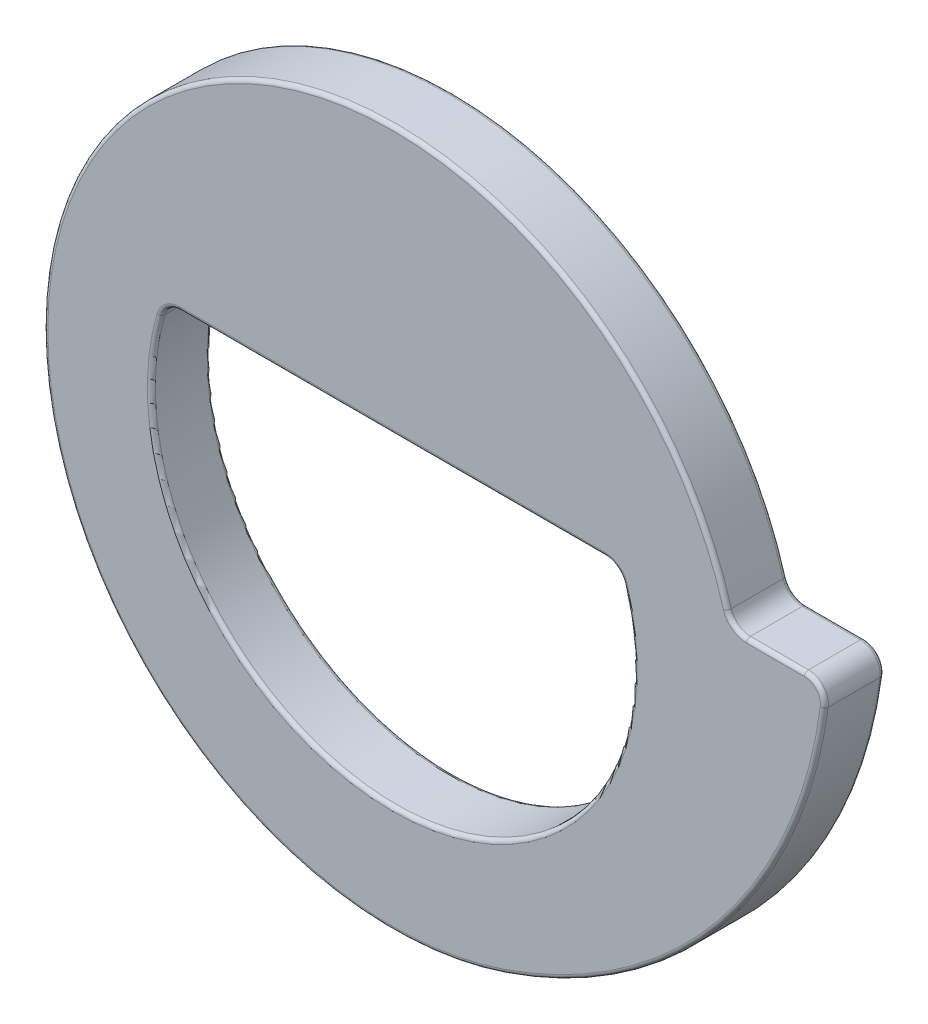
ISO-10303-21;
HEADER;
FILE_DESCRIPTION(('STEP AP214'),'2;1');
FILE_NAME('part.step','',(''),(''),'','','');
FILE_SCHEMA(('AUTOMOTIVE_DESIGN { 1 0 10303 214 1 1 1 1 }'));
ENDSEC;
DATA;
#1=APPLICATION_CONTEXT('core data for automotive mechanical design processes');
#2=APPLICATION_PROTOCOL_DEFINITION('international standard','automotive_design',2000,#1);
#3=PRODUCT_CONTEXT('',#1,'mechanical');
#4=PRODUCT('Part','Part','',(#3));
#5=PRODUCT_RELATED_PRODUCT_CATEGORY('part','',(#4));
#6=PRODUCT_DEFINITION_FORMATION('','',#4);
#7=PRODUCT_DEFINITION_CONTEXT('part definition',#1,'design');
#8=PRODUCT_DEFINITION('design','',#6,#7);
#9=PRODUCT_DEFINITION_SHAPE('','',#8);
#10=(LENGTH_UNIT() NAMED_UNIT(*) SI_UNIT(.MILLI.,.METRE.));
#11=(NAMED_UNIT(*) PLANE_ANGLE_UNIT() SI_UNIT($,.RADIAN.));
#12=(NAMED_UNIT(*) SI_UNIT($,.STERADIAN.) SOLID_ANGLE_UNIT());
#13=UNCERTAINTY_MEASURE_WITH_UNIT(LENGTH_MEASURE(1.E-05),#10,'distance_accuracy_value','');
#14=(GEOMETRIC_REPRESENTATION_CONTEXT(3) GLOBAL_UNCERTAINTY_ASSIGNED_CONTEXT((#13)) GLOBAL_UNIT_ASSIGNED_CONTEXT((#10,
#11,#12)) REPRESENTATION_CONTEXT('',''));
#15=CARTESIAN_POINT('',(0.,0.,0.));
#16=DIRECTION('',(0.,0.,1.));
#17=DIRECTION('',(1.,0.,0.));
#18=AXIS2_PLACEMENT_3D('',#15,#16,#17);
#19=CARTESIAN_POINT('',(8.891569040389,2.55,1.4));
#20=DIRECTION('',(0.,0.,1.));
#21=DIRECTION('',(1.,0.,0.));
#22=AXIS2_PLACEMENT_3D('',#19,#20,#21);
#23=TOROIDAL_SURFACE('',#22,0.6,0.1);
#24=CARTESIAN_POINT('',(8.891569040389,2.55,1.4));
#25=DIRECTION('',(0.,0.,-1.));
#26=DIRECTION('',(-1.,0.,0.));
#27=AXIS2_PLACEMENT_3D('',#24,#25,#26);
#28=CIRCLE('',#27,0.5);
#29=CARTESIAN_POINT('',(8.891569040389,2.05,1.4));
#30=VERTEX_POINT('',#29);
#31=CARTESIAN_POINT('',(8.41094368685429,2.41216216216223,1.4));
#32=VERTEX_POINT('',#31);
#33=EDGE_CURVE('E187',#30,#32,#28,.T.);
#34=ORIENTED_EDGE('',*,*,#33,.T.);
#35=CARTESIAN_POINT('',(8.31481861614721,2.38459459459506,1.4));
#36=DIRECTION('',(-0.275675675675729,0.96125070706904,0.));
#37=DIRECTION('',(0.96125070706904,0.275675675675729,0.));
#38=AXIS2_PLACEMENT_3D('',#35,#36,#37);
#39=CIRCLE('',#38,0.1);
#40=CARTESIAN_POINT('',(8.31481861614714,2.38459459459486,1.5));
#41=VERTEX_POINT('',#40);
#42=EDGE_CURVE('E179',#41,#32,#39,.T.);
#43=ORIENTED_EDGE('',*,*,#42,.F.);
#44=CARTESIAN_POINT('',(8.891569040389,2.55,1.5));
#45=DIRECTION('',(0.,0.,1.));
#46=DIRECTION('',(-0.961250707069043,-0.275675675675721,0.));
#47=AXIS2_PLACEMENT_3D('',#44,#45,#46);
#48=CIRCLE('',#47,0.600000000000431);
#49=CARTESIAN_POINT('',(8.891569040389,1.94999999999989,1.5));
#50=VERTEX_POINT('',#49);
#51=EDGE_CURVE('E158',#50,#41,#48,.F.);
#52=ORIENTED_EDGE('',*,*,#51,.F.);
#53=CARTESIAN_POINT('',(8.891569040389,1.95,1.4));
#54=DIRECTION('',(1.,0.,0.));
#55=DIRECTION('',(0.,0.,-1.));
#56=AXIS2_PLACEMENT_3D('',#53,#54,#55);
#57=CIRCLE('',#56,0.1);
#58=EDGE_CURVE('E308',#30,#50,#57,.T.);
#59=ORIENTED_EDGE('',*,*,#58,.F.);
#60=EDGE_LOOP('',(#34,#43,#52,#59));
#61=FACE_BOUND('',#60,.T.);
#62=ADVANCED_FACE('F17',(#61),#23,.T.);
#63=CARTESIAN_POINT('',(0.,0.,1.5));
#64=DIRECTION('',(0.,0.,1.));
#65=DIRECTION('',(1.,0.,0.));
#66=AXIS2_PLACEMENT_3D('',#63,#64,#65);
#67=PLANE('',#66);
#68=DIRECTION('',(-1.,0.,0.));
#69=VECTOR('',#68,1.);
#70=CARTESIAN_POINT('',(-5.32916503779,2.15,1.5));
#71=LINE('',#70,#69);
#72=CARTESIAN_POINT('',(5.32916503779,2.14999999999996,1.5));
#73=VERTEX_POINT('',#72);
#74=CARTESIAN_POINT('',(-5.32916503779,2.15,1.5));
#75=VERTEX_POINT('',#74);
#76=EDGE_CURVE('E246',#73,#75,#71,.T.);
#77=ORIENTED_EDGE('',*,*,#76,.F.);
#78=CARTESIAN_POINT('',(5.32916503779,1.55,1.5));
#79=DIRECTION('',(0.,0.,1.));
#80=DIRECTION('',(0.960209916718629,0.279279279280086,0.));
#81=AXIS2_PLACEMENT_3D('',#78,#79,#80);
#82=CIRCLE('',#81,0.599999999999815);
#83=CARTESIAN_POINT('',(5.905290987821,1.717567567568,1.5));
#84=VERTEX_POINT('',#83);
#85=EDGE_CURVE('E171',#84,#73,#82,.T.);
#86=ORIENTED_EDGE('',*,*,#85,.F.);
#87=CARTESIAN_POINT('',(0.,0.,1.5));
#88=DIRECTION('',(0.,0.,1.));
#89=DIRECTION('',(-0.960209916718847,0.279279279279336,0.));
#90=AXIS2_PLACEMENT_3D('',#87,#88,#89);
#91=CIRCLE('',#90,6.15000000000011);
#92=CARTESIAN_POINT('',(-5.90529098782103,1.71756756756799,1.5));
#93=VERTEX_POINT('',#92);
#94=EDGE_CURVE('E396',#93,#84,#91,.T.);
#95=ORIENTED_EDGE('',*,*,#94,.F.);
#96=CARTESIAN_POINT('',(-5.32916503779,1.55,1.5));
#97=DIRECTION('',(0.,0.,1.));
#98=DIRECTION('',(0.,1.,0.));
#99=AXIS2_PLACEMENT_3D('',#96,#97,#98);
#100=CIRCLE('',#99,0.6);
#101=EDGE_CURVE('E253',#75,#93,#100,.T.);
#102=ORIENTED_EDGE('',*,*,#101,.F.);
#103=EDGE_LOOP('',(#77,#86,#95,#102));
#104=FACE_BOUND('',#103,.T.);
#105=CARTESIAN_POINT('',(-1.049603066396,3.075846778208,1.5));
#106=DIRECTION('',(0.,0.,-1.));
#107=DIRECTION('',(0.991158614800501,-0.132682328539835,0.));
#108=AXIS2_PLACEMENT_3D('',#105,#106,#107);
#109=CIRCLE('',#108,11.9);
#110=CARTESIAN_POINT('',(10.7451844497301,1.49692706858399,1.5));
#111=VERTEX_POINT('',#110);
#112=CARTESIAN_POINT('',(2.79355893056096,-8.18648450199992,1.5));
#113=VERTEX_POINT('',#112);
#114=EDGE_CURVE('E189',#111,#113,#109,.T.);
#115=ORIENTED_EDGE('',*,*,#114,.F.);
#116=CARTESIAN_POINT('',(10.34872100381,1.55,1.5));
#117=DIRECTION('',(0.,0.,-1.));
#118=DIRECTION('',(0.,1.,0.));
#119=AXIS2_PLACEMENT_3D('',#116,#117,#118);
#120=CIRCLE('',#119,0.399999999999999);
#121=CARTESIAN_POINT('',(10.34872100381,1.95,1.5));
#122=VERTEX_POINT('',#121);
#123=EDGE_CURVE('E377',#122,#111,#120,.T.);
#124=ORIENTED_EDGE('',*,*,#123,.F.);
#125=DIRECTION('',(1.,0.,0.));
#126=VECTOR('',#125,1.);
#127=CARTESIAN_POINT('',(0.,1.95,1.5));
#128=LINE('',#127,#126);
#129=EDGE_CURVE('E167',#50,#122,#128,.T.);
#130=ORIENTED_EDGE('',*,*,#129,.F.);
#131=ORIENTED_EDGE('',*,*,#51,.T.);
#132=CARTESIAN_POINT('',(0.,0.,1.5));
#133=DIRECTION('',(0.,0.,-1.));
#134=DIRECTION('',(-1.,0.,0.));
#135=AXIS2_PLACEMENT_3D('',#132,#133,#134);
#136=CIRCLE('',#135,8.65);
#137=CARTESIAN_POINT('',(-8.65,0.,1.5));
#138=VERTEX_POINT('',#137);
#139=EDGE_CURVE('E164',#138,#41,#136,.T.);
#140=ORIENTED_EDGE('',*,*,#139,.F.);
#141=CARTESIAN_POINT('',(0.,0.,1.5));
#142=DIRECTION('',(0.,0.,-1.));
#143=DIRECTION('',(0.322954789660222,-0.946414393294778,0.));
#144=AXIS2_PLACEMENT_3D('',#141,#142,#143);
#145=CIRCLE('',#144,8.65000000000017);
#146=EDGE_CURVE('E182',#113,#138,#145,.T.);
#147=ORIENTED_EDGE('',*,*,#146,.F.);
#148=EDGE_LOOP('',(#115,#124,#130,#131,#140,#147));
#149=FACE_BOUND('',#148,.T.);
#150=ADVANCED_FACE('F162',(#104,#149),#67,.T.);
#151=CARTESIAN_POINT('',(5.32916503779,1.55,1.4));
#152=DIRECTION('',(0.,0.,1.));
#153=DIRECTION('',(1.,0.,0.));
#154=AXIS2_PLACEMENT_3D('',#151,#152,#153);
#155=TOROIDAL_SURFACE('',#154,0.6,0.1);
#156=ORIENTED_EDGE('',*,*,#85,.T.);
#157=CARTESIAN_POINT('',(5.32916503779,2.15,1.4));
#158=DIRECTION('',(-1.,0.,0.));
#159=DIRECTION('',(0.,0.,1.));
#160=AXIS2_PLACEMENT_3D('',#157,#158,#159);
#161=CIRCLE('',#160,0.1);
#162=CARTESIAN_POINT('',(5.32916503779,2.05,1.4));
#163=VERTEX_POINT('',#162);
#164=EDGE_CURVE('E236',#163,#73,#161,.T.);
#165=ORIENTED_EDGE('',*,*,#164,.F.);
#166=CARTESIAN_POINT('',(5.32916503779,1.55,1.4));
#167=DIRECTION('',(0.,0.,-1.));
#168=DIRECTION('',(-1.,0.,0.));
#169=AXIS2_PLACEMENT_3D('',#166,#167,#168);
#170=CIRCLE('',#169,0.5);
#171=CARTESIAN_POINT('',(5.8092699961491,1.68963963964003,1.4));
#172=VERTEX_POINT('',#171);
#173=EDGE_CURVE('E428',#163,#172,#170,.T.);
#174=ORIENTED_EDGE('',*,*,#173,.T.);
#175=CARTESIAN_POINT('',(5.90529098782091,1.71756756756797,1.4));
#176=DIRECTION('',(-0.279279279279345,0.960209916718844,0.));
#177=DIRECTION('',(0.960209916718844,0.279279279279345,0.));
#178=AXIS2_PLACEMENT_3D('',#175,#176,#177);
#179=CIRCLE('',#178,0.1);
#180=EDGE_CURVE('E238',#84,#172,#179,.F.);
#181=ORIENTED_EDGE('',*,*,#180,.F.);
#182=EDGE_LOOP('',(#156,#165,#174,#181));
#183=FACE_BOUND('',#182,.T.);
#184=ADVANCED_FACE('F199',(#183),#155,.T.);
#185=CARTESIAN_POINT('',(0.,0.,1.4));
#186=DIRECTION('',(0.,0.,1.));
#187=DIRECTION('',(1.,0.,0.));
#188=AXIS2_PLACEMENT_3D('',#185,#186,#187);
#189=TOROIDAL_SURFACE('',#188,8.64999999999999,0.1);
#190=CARTESIAN_POINT('',(0.,0.,1.4));
#191=DIRECTION('',(0.,0.,-1.));
#192=DIRECTION('',(-1.,0.,0.));
#193=AXIS2_PLACEMENT_3D('',#190,#191,#192);
#194=CIRCLE('',#193,8.75);
#195=CARTESIAN_POINT('',(2.82585440952704,-8.28112594132922,1.4));
#196=VERTEX_POINT('',#195);
#197=CARTESIAN_POINT('',(-8.75,0.,1.4));
#198=VERTEX_POINT('',#197);
#199=EDGE_CURVE('E375',#196,#198,#194,.T.);
#200=ORIENTED_EDGE('',*,*,#199,.F.);
#201=CARTESIAN_POINT('',(2.79355893056091,-8.18648450199976,1.4));
#202=DIRECTION('',(0.94641439329477,0.322954789660245,0.));
#203=DIRECTION('',(0.322954789660245,-0.94641439329477,0.));
#204=AXIS2_PLACEMENT_3D('',#201,#202,#203);
#205=CIRCLE('',#204,0.1);
#206=EDGE_CURVE('E191',#113,#196,#205,.T.);
#207=ORIENTED_EDGE('',*,*,#206,.F.);
#208=ORIENTED_EDGE('',*,*,#146,.T.);
#209=ORIENTED_EDGE('',*,*,#139,.T.);
#210=ORIENTED_EDGE('',*,*,#42,.T.);
#211=CARTESIAN_POINT('',(0.,0.,1.4));
#212=DIRECTION('',(0.,0.,-1.));
#213=DIRECTION('',(-1.,0.,0.));
#214=AXIS2_PLACEMENT_3D('',#211,#212,#213);
#215=CIRCLE('',#214,8.75);
#216=EDGE_CURVE('E384',#198,#32,#215,.T.);
#217=ORIENTED_EDGE('',*,*,#216,.F.);
#218=EDGE_LOOP('',(#200,#207,#208,#209,#210,#217));
#219=FACE_BOUND('',#218,.T.);
#220=ADVANCED_FACE('F177',(#219),#189,.T.);
#221=CARTESIAN_POINT('',(-1.049603066396,3.075846778208,1.4));
#222=DIRECTION('',(0.,0.,1.));
#223=DIRECTION('',(1.,0.,0.));
#224=AXIS2_PLACEMENT_3D('',#221,#222,#223);
#225=TOROIDAL_SURFACE('',#224,11.9,0.1);
#226=CARTESIAN_POINT('',(-1.049603066396,3.075846778208,1.4));
#227=DIRECTION('',(0.,0.,-1.));
#228=DIRECTION('',(-1.,0.,0.));
#229=AXIS2_PLACEMENT_3D('',#226,#227,#228);
#230=CIRCLE('',#229,12.);
#231=CARTESIAN_POINT('',(10.8443003112102,1.48365883572998,1.4));
#232=VERTEX_POINT('',#231);
#233=EDGE_CURVE('E327',#232,#196,#230,.T.);
#234=ORIENTED_EDGE('',*,*,#233,.F.);
#235=CARTESIAN_POINT('',(10.7451844497302,1.49692706858397,1.4));
#236=DIRECTION('',(0.132682328540064,0.99115861480047,0.));
#237=DIRECTION('',(0.99115861480047,-0.132682328540064,0.));
#238=AXIS2_PLACEMENT_3D('',#235,#236,#237);
#239=CIRCLE('',#238,0.1);
#240=EDGE_CURVE('E311',#111,#232,#239,.T.);
#241=ORIENTED_EDGE('',*,*,#240,.F.);
#242=ORIENTED_EDGE('',*,*,#114,.T.);
#243=ORIENTED_EDGE('',*,*,#206,.T.);
#244=EDGE_LOOP('',(#234,#241,#242,#243));
#245=FACE_BOUND('',#244,.T.);
#246=ADVANCED_FACE('F346',(#245),#225,.T.);
#247=CARTESIAN_POINT('',(10.34872100381,1.55,1.4));
#248=DIRECTION('',(0.,0.,1.));
#249=DIRECTION('',(1.,0.,0.));
#250=AXIS2_PLACEMENT_3D('',#247,#248,#249);
#251=TOROIDAL_SURFACE('',#250,0.399999999999999,0.1);
#252=ORIENTED_EDGE('',*,*,#123,.T.);
#253=ORIENTED_EDGE('',*,*,#240,.T.);
#254=CARTESIAN_POINT('',(10.34872100381,1.55,1.4));
#255=DIRECTION('',(0.,0.,-1.));
#256=DIRECTION('',(-1.,0.,0.));
#257=AXIS2_PLACEMENT_3D('',#254,#255,#256);
#258=CIRCLE('',#257,0.5);
#259=CARTESIAN_POINT('',(10.84872100381,1.55,1.4));
#260=VERTEX_POINT('',#259);
#261=EDGE_CURVE('E319',#260,#232,#258,.T.);
#262=ORIENTED_EDGE('',*,*,#261,.F.);
#263=CARTESIAN_POINT('',(10.34872100381,1.55,1.4));
#264=DIRECTION('',(0.,0.,-1.));
#265=DIRECTION('',(-1.,0.,0.));
#266=AXIS2_PLACEMENT_3D('',#263,#264,#265);
#267=CIRCLE('',#266,0.5);
#268=CARTESIAN_POINT('',(10.34872100381,2.05,1.4));
#269=VERTEX_POINT('',#268);
#270=EDGE_CURVE('E317',#269,#260,#267,.T.);
#271=ORIENTED_EDGE('',*,*,#270,.F.);
#272=CARTESIAN_POINT('',(10.34872100381,1.95,1.4));
#273=DIRECTION('',(1.,0.,0.));
#274=DIRECTION('',(0.,0.,-1.));
#275=AXIS2_PLACEMENT_3D('',#272,#273,#274);
#276=CIRCLE('',#275,0.1);
#277=EDGE_CURVE('E298',#122,#269,#276,.F.);
#278=ORIENTED_EDGE('',*,*,#277,.F.);
#279=EDGE_LOOP('',(#252,#253,#262,#271,#278));
#280=FACE_BOUND('',#279,.T.);
#281=ADVANCED_FACE('F342',(#280),#251,.T.);
#282=CARTESIAN_POINT('',(0.,1.95,1.4));
#283=DIRECTION('',(1.,0.,0.));
#284=DIRECTION('',(0.,0.,-1.));
#285=AXIS2_PLACEMENT_3D('',#282,#283,#284);
#286=CYLINDRICAL_SURFACE('',#285,0.1);
#287=ORIENTED_EDGE('',*,*,#129,.T.);
#288=ORIENTED_EDGE('',*,*,#277,.T.);
#289=DIRECTION('',(1.,0.,0.));
#290=VECTOR('',#289,1.);
#291=CARTESIAN_POINT('',(8.891569040389,2.05,1.4));
#292=LINE('',#291,#290);
#293=EDGE_CURVE('E301',#269,#30,#292,.F.);
#294=ORIENTED_EDGE('',*,*,#293,.T.);
#295=ORIENTED_EDGE('',*,*,#58,.T.);
#296=EDGE_LOOP('',(#287,#288,#294,#295));
#297=FACE_BOUND('',#296,.T.);
#298=ADVANCED_FACE('F345',(#297),#286,.T.);
#299=CARTESIAN_POINT('',(8.891569040389,2.55,1.5));
#300=DIRECTION('',(0.,0.,-1.));
#301=DIRECTION('',(-1.,0.,0.));
#302=AXIS2_PLACEMENT_3D('',#299,#300,#301);
#303=CYLINDRICAL_SURFACE('',#302,0.5);
#304=DIRECTION('',(0.,0.,-1.));
#305=VECTOR('',#304,1.);
#306=CARTESIAN_POINT('',(8.41094368685428,2.41216216216208,1.5));
#307=LINE('',#306,#305);
#308=CARTESIAN_POINT('',(8.41094368685431,2.41216216216215,0.09999999999998));
#309=VERTEX_POINT('',#308);
#310=EDGE_CURVE('E331',#32,#309,#307,.T.);
#311=ORIENTED_EDGE('',*,*,#310,.F.);
#312=ORIENTED_EDGE('',*,*,#33,.F.);
#313=DIRECTION('',(0.,0.,-1.));
#314=VECTOR('',#313,1.);
#315=CARTESIAN_POINT('',(8.891569040389,2.05,1.5));
#316=LINE('',#315,#314);
#317=CARTESIAN_POINT('',(8.891569040389,2.05,0.0999999999999876));
#318=VERTEX_POINT('',#317);
#319=EDGE_CURVE('E304',#30,#318,#316,.T.);
#320=ORIENTED_EDGE('',*,*,#319,.T.);
#321=CARTESIAN_POINT('',(8.891569040389,2.55,0.0999999999999801));
#322=DIRECTION('',(0.,0.,-1.));
#323=DIRECTION('',(-1.,0.,0.));
#324=AXIS2_PLACEMENT_3D('',#321,#322,#323);
#325=CIRCLE('',#324,0.5);
#326=EDGE_CURVE('E258',#309,#318,#325,.F.);
#327=ORIENTED_EDGE('',*,*,#326,.F.);
#328=EDGE_LOOP('',(#311,#312,#320,#327));
#329=FACE_BOUND('',#328,.T.);
#330=ADVANCED_FACE('F287',(#329),#303,.F.);
#331=CARTESIAN_POINT('',(-5.32916503779,1.55,1.4));
#332=DIRECTION('',(0.,0.,1.));
#333=DIRECTION('',(1.,0.,0.));
#334=AXIS2_PLACEMENT_3D('',#331,#332,#333);
#335=TOROIDAL_SURFACE('',#334,0.6,0.1);
#336=CARTESIAN_POINT('',(-5.32916503779,1.55,1.4));
#337=DIRECTION('',(0.,0.,-1.));
#338=DIRECTION('',(-1.,0.,0.));
#339=AXIS2_PLACEMENT_3D('',#336,#337,#338);
#340=CIRCLE('',#339,0.5);
#341=CARTESIAN_POINT('',(-5.80926999614908,1.68963963964002,1.4));
#342=VERTEX_POINT('',#341);
#343=CARTESIAN_POINT('',(-5.32916503779,2.05,1.4));
#344=VERTEX_POINT('',#343);
#345=EDGE_CURVE('E406',#342,#344,#340,.T.);
#346=ORIENTED_EDGE('',*,*,#345,.T.);
#347=CARTESIAN_POINT('',(-5.32916503779,2.15,1.4));
#348=DIRECTION('',(-1.,0.,0.));
#349=DIRECTION('',(0.,0.,1.));
#350=AXIS2_PLACEMENT_3D('',#347,#348,#349);
#351=CIRCLE('',#350,0.1);
#352=EDGE_CURVE('E251',#75,#344,#351,.F.);
#353=ORIENTED_EDGE('',*,*,#352,.F.);
#354=ORIENTED_EDGE('',*,*,#101,.T.);
#355=CARTESIAN_POINT('',(-5.90529098782089,1.71756756756794,1.4));
#356=DIRECTION('',(-0.279279279279339,-0.960209916718846,0.));
#357=DIRECTION('',(-0.960209916718846,0.279279279279339,0.));
#358=AXIS2_PLACEMENT_3D('',#355,#356,#357);
#359=CIRCLE('',#358,0.1);
#360=EDGE_CURVE('E389',#342,#93,#359,.T.);
#361=ORIENTED_EDGE('',*,*,#360,.F.);
#362=EDGE_LOOP('',(#346,#353,#354,#361));
#363=FACE_BOUND('',#362,.T.);
#364=ADVANCED_FACE('F276',(#363),#335,.T.);
#365=CARTESIAN_POINT('',(-5.32916503779,2.15,1.4));
#366=DIRECTION('',(-1.,0.,0.));
#367=DIRECTION('',(0.,0.,1.));
#368=AXIS2_PLACEMENT_3D('',#365,#366,#367);
#369=CYLINDRICAL_SURFACE('',#368,0.1);
#370=DIRECTION('',(1.,0.,0.));
#371=VECTOR('',#370,1.);
#372=CARTESIAN_POINT('',(-5.32916503779,2.05,1.4));
#373=LINE('',#372,#371);
#374=EDGE_CURVE('E249',#163,#344,#373,.F.);
#375=ORIENTED_EDGE('',*,*,#374,.F.);
#376=ORIENTED_EDGE('',*,*,#164,.T.);
#377=ORIENTED_EDGE('',*,*,#76,.T.);
#378=ORIENTED_EDGE('',*,*,#352,.T.);
#379=EDGE_LOOP('',(#375,#376,#377,#378));
#380=FACE_BOUND('',#379,.T.);
#381=ADVANCED_FACE('F245',(#380),#369,.T.);
#382=CARTESIAN_POINT('',(5.32916503779,1.55,1.5));
#383=DIRECTION('',(0.,0.,-1.));
#384=DIRECTION('',(-1.,0.,0.));
#385=AXIS2_PLACEMENT_3D('',#382,#383,#384);
#386=CYLINDRICAL_SURFACE('',#385,0.5);
#387=DIRECTION('',(0.,0.,-1.));
#388=VECTOR('',#387,1.);
#389=CARTESIAN_POINT('',(5.32916503779,2.05,1.5));
#390=LINE('',#389,#388);
#391=CARTESIAN_POINT('',(5.32916503779,2.05,0.09999999999999));
#392=VERTEX_POINT('',#391);
#393=EDGE_CURVE('E412',#392,#163,#390,.F.);
#394=ORIENTED_EDGE('',*,*,#393,.F.);
#395=CARTESIAN_POINT('',(5.32916503779,1.55,0.0999999999999801));
#396=DIRECTION('',(0.,0.,-1.));
#397=DIRECTION('',(-1.,0.,0.));
#398=AXIS2_PLACEMENT_3D('',#395,#396,#397);
#399=CIRCLE('',#398,0.5);
#400=CARTESIAN_POINT('',(5.8092699961491,1.68963963964003,0.09999999999998));
#401=VERTEX_POINT('',#400);
#402=EDGE_CURVE('E250',#401,#392,#399,.F.);
#403=ORIENTED_EDGE('',*,*,#402,.F.);
#404=DIRECTION('',(0.,0.,-1.));
#405=VECTOR('',#404,1.);
#406=CARTESIAN_POINT('',(5.80926999614903,1.68963963964001,1.5));
#407=LINE('',#406,#405);
#408=EDGE_CURVE('E425',#401,#172,#407,.F.);
#409=ORIENTED_EDGE('',*,*,#408,.T.);
#410=ORIENTED_EDGE('',*,*,#173,.F.);
#411=EDGE_LOOP('',(#394,#403,#409,#410));
#412=FACE_BOUND('',#411,.T.);
#413=ADVANCED_FACE('F441',(#412),#386,.F.);
#414=CARTESIAN_POINT('',(0.,0.,1.4));
#415=DIRECTION('',(0.,0.,1.));
#416=DIRECTION('',(1.,0.,0.));
#417=AXIS2_PLACEMENT_3D('',#414,#415,#416);
#418=TOROIDAL_SURFACE('',#417,6.14999999999999,0.1);
#419=CARTESIAN_POINT('',(0.,0.,1.4));
#420=DIRECTION('',(0.,0.,-1.));
#421=DIRECTION('',(-1.,0.,0.));
#422=AXIS2_PLACEMENT_3D('',#419,#420,#421);
#423=CIRCLE('',#422,6.05);
#424=EDGE_CURVE('E422',#172,#342,#423,.T.);
#425=ORIENTED_EDGE('',*,*,#424,.T.);
#426=ORIENTED_EDGE('',*,*,#360,.T.);
#427=ORIENTED_EDGE('',*,*,#94,.T.);
#428=ORIENTED_EDGE('',*,*,#180,.T.);
#429=EDGE_LOOP('',(#425,#426,#427,#428));
#430=FACE_BOUND('',#429,.T.);
#431=ADVANCED_FACE('F436',(#430),#418,.T.);
#432=CARTESIAN_POINT('',(0.,0.,1.5));
#433=DIRECTION('',(0.,0.,-1.));
#434=DIRECTION('',(-1.,0.,0.));
#435=AXIS2_PLACEMENT_3D('',#432,#433,#434);
#436=CYLINDRICAL_SURFACE('',#435,8.75);
#437=ORIENTED_EDGE('',*,*,#216,.T.);
#438=ORIENTED_EDGE('',*,*,#310,.T.);
#439=CARTESIAN_POINT('',(0.,0.,0.09999999999998));
#440=DIRECTION('',(0.,0.,1.));
#441=DIRECTION('',(1.,0.,0.));
#442=AXIS2_PLACEMENT_3D('',#439,#440,#441);
#443=CIRCLE('',#442,8.75);
#444=CARTESIAN_POINT('',(-8.75,0.,0.09999999999998));
#445=VERTEX_POINT('',#444);
#446=EDGE_CURVE('E681',#445,#309,#443,.F.);
#447=ORIENTED_EDGE('',*,*,#446,.F.);
#448=CARTESIAN_POINT('',(0.,0.,0.09999999999998));
#449=DIRECTION('',(0.,0.,1.));
#450=DIRECTION('',(1.,0.,0.));
#451=AXIS2_PLACEMENT_3D('',#448,#449,#450);
#452=CIRCLE('',#451,8.75);
#453=CARTESIAN_POINT('',(2.82585440952708,-8.28112594132921,0.09999999999998));
#454=VERTEX_POINT('',#453);
#455=EDGE_CURVE('E424',#454,#445,#452,.F.);
#456=ORIENTED_EDGE('',*,*,#455,.F.);
#457=DIRECTION('',(0.,0.,-1.));
#458=VECTOR('',#457,1.);
#459=CARTESIAN_POINT('',(2.82585440952707,-8.28112594132919,1.5));
#460=LINE('',#459,#458);
#461=EDGE_CURVE('E330',#196,#454,#460,.T.);
#462=ORIENTED_EDGE('',*,*,#461,.F.);
#463=ORIENTED_EDGE('',*,*,#199,.T.);
#464=EDGE_LOOP('',(#437,#438,#447,#456,#462,#463));
#465=FACE_BOUND('',#464,.T.);
#466=ADVANCED_FACE('F440',(#465),#436,.T.);
#467=CARTESIAN_POINT('',(-1.049603066396,3.075846778208,1.5));
#468=DIRECTION('',(0.,0.,-1.));
#469=DIRECTION('',(-1.,0.,0.));
#470=AXIS2_PLACEMENT_3D('',#467,#468,#469);
#471=CYLINDRICAL_SURFACE('',#470,12.);
#472=ORIENTED_EDGE('',*,*,#233,.T.);
#473=ORIENTED_EDGE('',*,*,#461,.T.);
#474=CARTESIAN_POINT('',(-1.049603066396,3.075846778208,0.09999999999998));
#475=DIRECTION('',(0.,0.,1.));
#476=DIRECTION('',(1.,0.,0.));
#477=AXIS2_PLACEMENT_3D('',#474,#475,#476);
#478=CIRCLE('',#477,12.);
#479=CARTESIAN_POINT('',(10.8443003112102,1.48365883572998,0.09999999999998));
#480=VERTEX_POINT('',#479);
#481=EDGE_CURVE('E649',#480,#454,#478,.F.);
#482=ORIENTED_EDGE('',*,*,#481,.F.);
#483=DIRECTION('',(0.,0.,-1.));
#484=VECTOR('',#483,1.);
#485=CARTESIAN_POINT('',(10.8443003112102,1.48365883572997,1.5));
#486=LINE('',#485,#484);
#487=EDGE_CURVE('E323',#232,#480,#486,.T.);
#488=ORIENTED_EDGE('',*,*,#487,.F.);
#489=EDGE_LOOP('',(#472,#473,#482,#488));
#490=FACE_BOUND('',#489,.T.);
#491=ADVANCED_FACE('F778',(#490),#471,.T.);
#492=CARTESIAN_POINT('',(10.34872100381,1.55,1.5));
#493=DIRECTION('',(0.,0.,-1.));
#494=DIRECTION('',(-1.,0.,0.));
#495=AXIS2_PLACEMENT_3D('',#492,#493,#494);
#496=CYLINDRICAL_SURFACE('',#495,0.5);
#497=ORIENTED_EDGE('',*,*,#261,.T.);
#498=ORIENTED_EDGE('',*,*,#487,.T.);
#499=CARTESIAN_POINT('',(10.34872100381,1.55,0.0999999999999801));
#500=DIRECTION('',(0.,0.,-1.));
#501=DIRECTION('',(-1.,0.,0.));
#502=AXIS2_PLACEMENT_3D('',#499,#500,#501);
#503=CIRCLE('',#502,0.5);
#504=CARTESIAN_POINT('',(10.84872100381,1.55,0.09999999999998));
#505=VERTEX_POINT('',#504);
#506=EDGE_CURVE('E320',#480,#505,#503,.F.);
#507=ORIENTED_EDGE('',*,*,#506,.T.);
#508=CARTESIAN_POINT('',(10.34872100381,1.55,0.09999999999998));
#509=DIRECTION('',(0.,0.,1.));
#510=DIRECTION('',(1.,0.,0.));
#511=AXIS2_PLACEMENT_3D('',#508,#509,#510);
#512=CIRCLE('',#511,0.5);
#513=CARTESIAN_POINT('',(10.34872100381,2.05,0.0999999999999875));
#514=VERTEX_POINT('',#513);
#515=EDGE_CURVE('E629',#514,#505,#512,.F.);
#516=ORIENTED_EDGE('',*,*,#515,.F.);
#517=DIRECTION('',(0.,0.,-1.));
#518=VECTOR('',#517,1.);
#519=CARTESIAN_POINT('',(10.34872100381,2.05,1.5));
#520=LINE('',#519,#518);
#521=EDGE_CURVE('E305',#514,#269,#520,.F.);
#522=ORIENTED_EDGE('',*,*,#521,.T.);
#523=ORIENTED_EDGE('',*,*,#270,.T.);
#524=EDGE_LOOP('',(#497,#498,#507,#516,#522,#523));
#525=FACE_BOUND('',#524,.T.);
#526=ADVANCED_FACE('F766',(#525),#496,.T.);
#527=CARTESIAN_POINT('',(8.891569040389,2.05,1.5));
#528=DIRECTION('',(0.,-1.,0.));
#529=DIRECTION('',(0.,0.,-1.));
#530=AXIS2_PLACEMENT_3D('',#527,#528,#529);
#531=PLANE('',#530);
#532=ORIENTED_EDGE('',*,*,#319,.F.);
#533=ORIENTED_EDGE('',*,*,#293,.F.);
#534=ORIENTED_EDGE('',*,*,#521,.F.);
#535=DIRECTION('',(-1.,0.,0.));
#536=VECTOR('',#535,1.);
#537=CARTESIAN_POINT('',(8.891569040389,2.05,0.09999999999999));
#538=LINE('',#537,#536);
#539=EDGE_CURVE('E598',#318,#514,#538,.F.);
#540=ORIENTED_EDGE('',*,*,#539,.F.);
#541=EDGE_LOOP('',(#532,#533,#534,#540));
#542=FACE_BOUND('',#541,.T.);
#543=ADVANCED_FACE('F764',(#542),#531,.F.);
#544=CARTESIAN_POINT('',(-5.32916503779,1.55,1.5));
#545=DIRECTION('',(0.,0.,-1.));
#546=DIRECTION('',(-1.,0.,0.));
#547=AXIS2_PLACEMENT_3D('',#544,#545,#546);
#548=CYLINDRICAL_SURFACE('',#547,0.5);
#549=DIRECTION('',(0.,0.,-1.));
#550=VECTOR('',#549,1.);
#551=CARTESIAN_POINT('',(-5.809269996149,1.68963963964,1.5));
#552=LINE('',#551,#550);
#553=CARTESIAN_POINT('',(-5.80926999614907,1.68963963964005,0.099999999999985));
#554=VERTEX_POINT('',#553);
#555=EDGE_CURVE('E704',#342,#554,#552,.T.);
#556=ORIENTED_EDGE('',*,*,#555,.T.);
#557=CARTESIAN_POINT('',(-5.32916503779,1.55,0.1));
#558=DIRECTION('',(0.,0.,1.));
#559=DIRECTION('',(1.,0.,0.));
#560=AXIS2_PLACEMENT_3D('',#557,#558,#559);
#561=CIRCLE('',#560,0.5);
#562=CARTESIAN_POINT('',(-5.32916503779,2.05,0.1));
#563=VERTEX_POINT('',#562);
#564=EDGE_CURVE('E597',#563,#554,#561,.T.);
#565=ORIENTED_EDGE('',*,*,#564,.F.);
#566=DIRECTION('',(0.,0.,-1.));
#567=VECTOR('',#566,1.);
#568=CARTESIAN_POINT('',(-5.32916503779,2.05,1.5));
#569=LINE('',#568,#567);
#570=EDGE_CURVE('E405',#344,#563,#569,.T.);
#571=ORIENTED_EDGE('',*,*,#570,.F.);
#572=ORIENTED_EDGE('',*,*,#345,.F.);
#573=EDGE_LOOP('',(#556,#565,#571,#572));
#574=FACE_BOUND('',#573,.T.);
#575=ADVANCED_FACE('F831',(#574),#548,.F.);
#576=CARTESIAN_POINT('',(-5.32916503779,2.05,1.5));
#577=DIRECTION('',(0.,-1.,0.));
#578=DIRECTION('',(0.,0.,-1.));
#579=AXIS2_PLACEMENT_3D('',#576,#577,#578);
#580=PLANE('',#579);
#581=DIRECTION('',(1.,0.,0.));
#582=VECTOR('',#581,1.);
#583=CARTESIAN_POINT('',(0.,2.05,0.1));
#584=LINE('',#583,#582);
#585=EDGE_CURVE('E573',#392,#563,#584,.F.);
#586=ORIENTED_EDGE('',*,*,#585,.F.);
#587=ORIENTED_EDGE('',*,*,#393,.T.);
#588=ORIENTED_EDGE('',*,*,#374,.T.);
#589=ORIENTED_EDGE('',*,*,#570,.T.);
#590=EDGE_LOOP('',(#586,#587,#588,#589));
#591=FACE_BOUND('',#590,.T.);
#592=ADVANCED_FACE('F832',(#591),#580,.T.);
#593=CARTESIAN_POINT('',(0.,0.,1.5));
#594=DIRECTION('',(0.,0.,-1.));
#595=DIRECTION('',(-1.,0.,0.));
#596=AXIS2_PLACEMENT_3D('',#593,#594,#595);
#597=CYLINDRICAL_SURFACE('',#596,6.05);
#598=ORIENTED_EDGE('',*,*,#408,.F.);
#599=CARTESIAN_POINT('',(0.,0.,0.09999999999998));
#600=DIRECTION('',(0.,0.,1.));
#601=DIRECTION('',(1.,0.,0.));
#602=AXIS2_PLACEMENT_3D('',#599,#600,#601);
#603=CIRCLE('',#602,6.05);
#604=EDGE_CURVE('E543',#554,#401,#603,.T.);
#605=ORIENTED_EDGE('',*,*,#604,.F.);
#606=ORIENTED_EDGE('',*,*,#555,.F.);
#607=ORIENTED_EDGE('',*,*,#424,.F.);
#608=EDGE_LOOP('',(#598,#605,#606,#607));
#609=FACE_BOUND('',#608,.T.);
#610=ADVANCED_FACE('F821',(#609),#597,.F.);
#611=CARTESIAN_POINT('',(8.891569040389,2.55,0.1));
#612=DIRECTION('',(0.,0.,1.));
#613=DIRECTION('',(1.,0.,0.));
#614=AXIS2_PLACEMENT_3D('',#611,#612,#613);
#615=TOROIDAL_SURFACE('',#614,0.6,0.1);
#616=CARTESIAN_POINT('',(8.891569040389,2.55,0.));
#617=DIRECTION('',(0.,0.,-1.));
#618=DIRECTION('',(0.,-1.,0.));
#619=AXIS2_PLACEMENT_3D('',#616,#617,#618);
#620=CIRCLE('',#619,0.6);
#621=CARTESIAN_POINT('',(8.891569040389,1.95,0.));
#622=VERTEX_POINT('',#621);
#623=CARTESIAN_POINT('',(8.31481861614717,2.38459459459481,0.));
#624=VERTEX_POINT('',#623);
#625=EDGE_CURVE('E547',#622,#624,#620,.T.);
#626=ORIENTED_EDGE('',*,*,#625,.T.);
#627=CARTESIAN_POINT('',(8.31481861614737,2.38459459459451,0.09999999999998));
#628=DIRECTION('',(-0.275675675675666,0.961250707069058,0.));
#629=DIRECTION('',(0.961250707069058,0.275675675675666,0.));
#630=AXIS2_PLACEMENT_3D('',#627,#628,#629);
#631=CIRCLE('',#630,0.1);
#632=EDGE_CURVE('E674',#309,#624,#631,.T.);
#633=ORIENTED_EDGE('',*,*,#632,.F.);
#634=ORIENTED_EDGE('',*,*,#326,.T.);
#635=CARTESIAN_POINT('',(8.891569040389,1.95,0.09999999999998));
#636=DIRECTION('',(-1.,0.,0.));
#637=DIRECTION('',(0.,0.,1.));
#638=AXIS2_PLACEMENT_3D('',#635,#636,#637);
#639=CIRCLE('',#638,0.1);
#640=EDGE_CURVE('E601',#622,#318,#639,.F.);
#641=ORIENTED_EDGE('',*,*,#640,.F.);
#642=EDGE_LOOP('',(#626,#633,#634,#641));
#643=FACE_BOUND('',#642,.T.);
#644=ADVANCED_FACE('F660',(#643),#615,.T.);
#645=CARTESIAN_POINT('',(0.,0.,0.09999999999998));
#646=DIRECTION('',(0.,0.,1.));
#647=DIRECTION('',(1.,0.,0.));
#648=AXIS2_PLACEMENT_3D('',#645,#646,#647);
#649=TOROIDAL_SURFACE('',#648,8.64999999999999,0.1);
#650=CARTESIAN_POINT('',(0.,0.,0.));
#651=DIRECTION('',(0.,0.,1.));
#652=DIRECTION('',(-1.,0.,0.));
#653=AXIS2_PLACEMENT_3D('',#650,#651,#652);
#654=CIRCLE('',#653,8.65);
#655=CARTESIAN_POINT('',(-8.65,0.,0.));
#656=VERTEX_POINT('',#655);
#657=CARTESIAN_POINT('',(2.79355893056102,-8.1864845019999,0.));
#658=VERTEX_POINT('',#657);
#659=EDGE_CURVE('E774',#656,#658,#654,.T.);
#660=ORIENTED_EDGE('',*,*,#659,.T.);
#661=CARTESIAN_POINT('',(2.79355893056104,-8.18648450199972,0.09999999999998));
#662=DIRECTION('',(0.946414393294766,0.322954789660256,0.));
#663=DIRECTION('',(0.322954789660256,-0.946414393294766,0.));
#664=AXIS2_PLACEMENT_3D('',#661,#662,#663);
#665=CIRCLE('',#664,0.1);
#666=EDGE_CURVE('E642',#454,#658,#665,.T.);
#667=ORIENTED_EDGE('',*,*,#666,.F.);
#668=ORIENTED_EDGE('',*,*,#455,.T.);
#669=ORIENTED_EDGE('',*,*,#446,.T.);
#670=ORIENTED_EDGE('',*,*,#632,.T.);
#671=CARTESIAN_POINT('',(0.,0.,0.));
#672=DIRECTION('',(0.,0.,1.));
#673=DIRECTION('',(0.961250707069059,0.275675675675666,0.));
#674=AXIS2_PLACEMENT_3D('',#671,#672,#673);
#675=CIRCLE('',#674,8.64999999999976);
#676=EDGE_CURVE('E773',#624,#656,#675,.T.);
#677=ORIENTED_EDGE('',*,*,#676,.T.);
#678=EDGE_LOOP('',(#660,#667,#668,#669,#670,#677));
#679=FACE_BOUND('',#678,.T.);
#680=ADVANCED_FACE('F656',(#679),#649,.T.);
#681=CARTESIAN_POINT('',(-1.049603066396,3.075846778208,0.09999999999998));
#682=DIRECTION('',(0.,0.,1.));
#683=DIRECTION('',(1.,0.,0.));
#684=AXIS2_PLACEMENT_3D('',#681,#682,#683);
#685=TOROIDAL_SURFACE('',#684,11.9,0.1);
#686=CARTESIAN_POINT('',(-1.049603066396,3.075846778208,0.));
#687=DIRECTION('',(0.,0.,1.));
#688=DIRECTION('',(0.32295478966026,-0.946414393294765,0.));
#689=AXIS2_PLACEMENT_3D('',#686,#687,#688);
#690=CIRCLE('',#689,11.9000000000001);
#691=CARTESIAN_POINT('',(10.7451844497301,1.49692706858399,0.));
#692=VERTEX_POINT('',#691);
#693=EDGE_CURVE('E638',#658,#692,#690,.T.);
#694=ORIENTED_EDGE('',*,*,#693,.T.);
#695=CARTESIAN_POINT('',(10.7451844497302,1.49692706858397,0.09999999999998));
#696=DIRECTION('',(0.132682328540064,0.99115861480047,0.));
#697=DIRECTION('',(0.99115861480047,-0.132682328540064,0.));
#698=AXIS2_PLACEMENT_3D('',#695,#696,#697);
#699=CIRCLE('',#698,0.1);
#700=EDGE_CURVE('E604',#480,#692,#699,.T.);
#701=ORIENTED_EDGE('',*,*,#700,.F.);
#702=ORIENTED_EDGE('',*,*,#481,.T.);
#703=ORIENTED_EDGE('',*,*,#666,.T.);
#704=EDGE_LOOP('',(#694,#701,#702,#703));
#705=FACE_BOUND('',#704,.T.);
#706=ADVANCED_FACE('F615',(#705),#685,.T.);
#707=CARTESIAN_POINT('',(10.34872100381,1.55,0.09999999999998));
#708=DIRECTION('',(0.,0.,1.));
#709=DIRECTION('',(1.,0.,0.));
#710=AXIS2_PLACEMENT_3D('',#707,#708,#709);
#711=TOROIDAL_SURFACE('',#710,0.399999999999999,0.1);
#712=ORIENTED_EDGE('',*,*,#506,.F.);
#713=ORIENTED_EDGE('',*,*,#700,.T.);
#714=CARTESIAN_POINT('',(10.34872100381,1.55,0.));
#715=DIRECTION('',(0.,0.,1.));
#716=DIRECTION('',(0.99115861480047,-0.132682328540064,0.));
#717=AXIS2_PLACEMENT_3D('',#714,#715,#716);
#718=CIRCLE('',#717,0.399999999999905);
#719=CARTESIAN_POINT('',(10.34872100381,1.94999999999997,0.));
#720=VERTEX_POINT('',#719);
#721=EDGE_CURVE('E527',#692,#720,#718,.T.);
#722=ORIENTED_EDGE('',*,*,#721,.T.);
#723=CARTESIAN_POINT('',(10.34872100381,1.95,0.09999999999998));
#724=DIRECTION('',(-1.,0.,0.));
#725=DIRECTION('',(0.,0.,1.));
#726=AXIS2_PLACEMENT_3D('',#723,#724,#725);
#727=CIRCLE('',#726,0.1);
#728=EDGE_CURVE('E590',#514,#720,#727,.T.);
#729=ORIENTED_EDGE('',*,*,#728,.F.);
#730=ORIENTED_EDGE('',*,*,#515,.T.);
#731=EDGE_LOOP('',(#712,#713,#722,#729,#730));
#732=FACE_BOUND('',#731,.T.);
#733=ADVANCED_FACE('F611',(#732),#711,.T.);
#734=CARTESIAN_POINT('',(8.891569040389,1.95,0.09999999999998));
#735=DIRECTION('',(-1.,0.,0.));
#736=DIRECTION('',(0.,0.,1.));
#737=AXIS2_PLACEMENT_3D('',#734,#735,#736);
#738=CYLINDRICAL_SURFACE('',#737,0.1);
#739=ORIENTED_EDGE('',*,*,#539,.T.);
#740=ORIENTED_EDGE('',*,*,#728,.T.);
#741=DIRECTION('',(1.,0.,0.));
#742=VECTOR('',#741,1.);
#743=CARTESIAN_POINT('',(0.,1.95,0.));
#744=LINE('',#743,#742);
#745=EDGE_CURVE('E524',#720,#622,#744,.F.);
#746=ORIENTED_EDGE('',*,*,#745,.T.);
#747=ORIENTED_EDGE('',*,*,#640,.T.);
#748=EDGE_LOOP('',(#739,#740,#746,#747));
#749=FACE_BOUND('',#748,.T.);
#750=ADVANCED_FACE('F584',(#749),#738,.T.);
#751=CARTESIAN_POINT('',(-5.32916503779,1.55,0.09999999999999));
#752=DIRECTION('',(0.,0.,1.));
#753=DIRECTION('',(1.,0.,0.));
#754=AXIS2_PLACEMENT_3D('',#751,#752,#753);
#755=TOROIDAL_SURFACE('',#754,0.6,0.1);
#756=CARTESIAN_POINT('',(-5.32916503779,1.55,0.));
#757=DIRECTION('',(0.,0.,-1.));
#758=DIRECTION('',(-0.960209916718602,0.279279279280177,0.));
#759=AXIS2_PLACEMENT_3D('',#756,#757,#758);
#760=CIRCLE('',#759,0.599999999999907);
#761=CARTESIAN_POINT('',(-5.90529098782099,1.71756756756801,0.));
#762=VERTEX_POINT('',#761);
#763=CARTESIAN_POINT('',(-5.32916503779,2.14999999999998,0.));
#764=VERTEX_POINT('',#763);
#765=EDGE_CURVE('E521',#762,#764,#760,.T.);
#766=ORIENTED_EDGE('',*,*,#765,.T.);
#767=CARTESIAN_POINT('',(-5.32916503779,2.15,0.09999999999998));
#768=DIRECTION('',(1.,0.,0.));
#769=DIRECTION('',(0.,0.,-1.));
#770=AXIS2_PLACEMENT_3D('',#767,#768,#769);
#771=CIRCLE('',#770,0.1);
#772=EDGE_CURVE('E569',#563,#764,#771,.T.);
#773=ORIENTED_EDGE('',*,*,#772,.F.);
#774=ORIENTED_EDGE('',*,*,#564,.T.);
#775=CARTESIAN_POINT('',(-5.90529098782088,1.71756756756796,0.09999999999998));
#776=DIRECTION('',(-0.279279279279344,-0.960209916718844,0.));
#777=DIRECTION('',(-0.960209916718844,0.279279279279344,0.));
#778=AXIS2_PLACEMENT_3D('',#775,#776,#777);
#779=CIRCLE('',#778,0.1);
#780=EDGE_CURVE('E542',#762,#554,#779,.T.);
#781=ORIENTED_EDGE('',*,*,#780,.F.);
#782=EDGE_LOOP('',(#766,#773,#774,#781));
#783=FACE_BOUND('',#782,.T.);
#784=ADVANCED_FACE('F580',(#783),#755,.T.);
#785=CARTESIAN_POINT('',(0.,2.15,0.09999999999998));
#786=DIRECTION('',(1.,0.,0.));
#787=DIRECTION('',(0.,0.,-1.));
#788=AXIS2_PLACEMENT_3D('',#785,#786,#787);
#789=CYLINDRICAL_SURFACE('',#788,0.1);
#790=DIRECTION('',(1.,0.,0.));
#791=VECTOR('',#790,1.);
#792=CARTESIAN_POINT('',(0.,2.15,0.));
#793=LINE('',#792,#791);
#794=CARTESIAN_POINT('',(5.32916503779,2.15,0.));
#795=VERTEX_POINT('',#794);
#796=EDGE_CURVE('E513',#764,#795,#793,.T.);
#797=ORIENTED_EDGE('',*,*,#796,.T.);
#798=CARTESIAN_POINT('',(5.32916503779,2.15,0.1));
#799=DIRECTION('',(-1.,0.,0.));
#800=DIRECTION('',(0.,1.,0.));
#801=AXIS2_PLACEMENT_3D('',#798,#799,#800);
#802=CIRCLE('',#801,0.1);
#803=EDGE_CURVE('E562',#392,#795,#802,.F.);
#804=ORIENTED_EDGE('',*,*,#803,.F.);
#805=ORIENTED_EDGE('',*,*,#585,.T.);
#806=ORIENTED_EDGE('',*,*,#772,.T.);
#807=EDGE_LOOP('',(#797,#804,#805,#806));
#808=FACE_BOUND('',#807,.T.);
#809=ADVANCED_FACE('F556',(#808),#789,.T.);
#810=CARTESIAN_POINT('',(5.32916503779,1.55,0.1));
#811=DIRECTION('',(0.,0.,1.));
#812=DIRECTION('',(1.,0.,0.));
#813=AXIS2_PLACEMENT_3D('',#810,#811,#812);
#814=TOROIDAL_SURFACE('',#813,0.6,0.1);
#815=ORIENTED_EDGE('',*,*,#402,.T.);
#816=ORIENTED_EDGE('',*,*,#803,.T.);
#817=CARTESIAN_POINT('',(5.32916503779,1.55,0.));
#818=DIRECTION('',(0.,0.,-1.));
#819=DIRECTION('',(0.,1.,0.));
#820=AXIS2_PLACEMENT_3D('',#817,#818,#819);
#821=CIRCLE('',#820,0.6);
#822=CARTESIAN_POINT('',(5.90529098782102,1.717567567568,0.));
#823=VERTEX_POINT('',#822);
#824=EDGE_CURVE('E29',#795,#823,#821,.T.);
#825=ORIENTED_EDGE('',*,*,#824,.T.);
#826=CARTESIAN_POINT('',(5.90529098782091,1.71756756756794,0.09999999999998));
#827=DIRECTION('',(-0.27927927927934,0.960209916718845,0.));
#828=DIRECTION('',(0.960209916718845,0.27927927927934,0.));
#829=AXIS2_PLACEMENT_3D('',#826,#827,#828);
#830=CIRCLE('',#829,0.1);
#831=EDGE_CURVE('E36',#401,#823,#830,.F.);
#832=ORIENTED_EDGE('',*,*,#831,.F.);
#833=EDGE_LOOP('',(#815,#816,#825,#832));
#834=FACE_BOUND('',#833,.T.);
#835=ADVANCED_FACE('F458',(#834),#814,.T.);
#836=CARTESIAN_POINT('',(0.,0.,0.09999999999998));
#837=DIRECTION('',(0.,0.,1.));
#838=DIRECTION('',(1.,0.,0.));
#839=AXIS2_PLACEMENT_3D('',#836,#837,#838);
#840=TOROIDAL_SURFACE('',#839,6.14999999999999,0.1);
#841=CARTESIAN_POINT('',(0.,0.,0.));
#842=DIRECTION('',(0.,0.,-1.));
#843=DIRECTION('',(0.960209916718846,0.279279279279337,0.));
#844=AXIS2_PLACEMENT_3D('',#841,#842,#843);
#845=CIRCLE('',#844,6.15000000000004);
#846=EDGE_CURVE('E11',#823,#762,#845,.T.);
#847=ORIENTED_EDGE('',*,*,#846,.T.);
#848=ORIENTED_EDGE('',*,*,#780,.T.);
#849=ORIENTED_EDGE('',*,*,#604,.T.);
#850=ORIENTED_EDGE('',*,*,#831,.T.);
#851=EDGE_LOOP('',(#847,#848,#849,#850));
#852=FACE_BOUND('',#851,.T.);
#853=ADVANCED_FACE('F452',(#852),#840,.T.);
#854=CARTESIAN_POINT('',(0.,0.,0.));
#855=DIRECTION('',(0.,0.,1.));
#856=DIRECTION('',(1.,0.,0.));
#857=AXIS2_PLACEMENT_3D('',#854,#855,#856);
#858=PLANE('',#857);
#859=ORIENTED_EDGE('',*,*,#824,.F.);
#860=ORIENTED_EDGE('',*,*,#796,.F.);
#861=ORIENTED_EDGE('',*,*,#765,.F.);
#862=ORIENTED_EDGE('',*,*,#846,.F.);
#863=EDGE_LOOP('',(#859,#860,#861,#862));
#864=FACE_BOUND('',#863,.T.);
#865=ORIENTED_EDGE('',*,*,#721,.F.);
#866=ORIENTED_EDGE('',*,*,#693,.F.);
#867=ORIENTED_EDGE('',*,*,#659,.F.);
#868=ORIENTED_EDGE('',*,*,#676,.F.);
#869=ORIENTED_EDGE('',*,*,#625,.F.);
#870=ORIENTED_EDGE('',*,*,#745,.F.);
#871=EDGE_LOOP('',(#865,#866,#867,#868,#869,#870));
#872=FACE_BOUND('',#871,.T.);
#873=ADVANCED_FACE('F450',(#864,#872),#858,.F.);
#874=CLOSED_SHELL('',(#62,#150,#184,#220,#246,#281,#298,#330,#364,#381,#413,#431,#466,#491,#526,
#543,#575,#592,#610,#644,#680,#706,#733,#750,#784,#809,#835,#853,#873));
#875=MANIFOLD_SOLID_BREP('B1',#874);
#876=ADVANCED_BREP_SHAPE_REPRESENTATION('',(#18,#875),#14);
#877=SHAPE_DEFINITION_REPRESENTATION(#9,#876);
ENDSEC;
END-ISO-10303-21;
